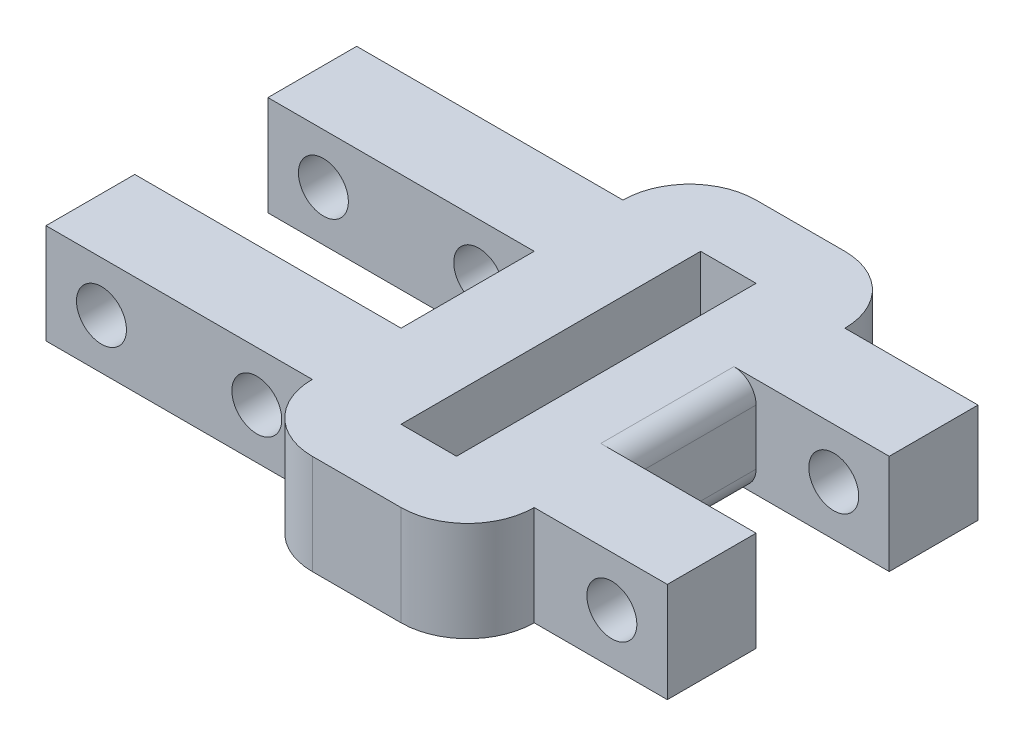
ISO-10303-21;
HEADER;
FILE_DESCRIPTION(('STEP AP214'),'2;1');
FILE_NAME('part.step','',(''),(''),'','','');
FILE_SCHEMA(('AUTOMOTIVE_DESIGN { 1 0 10303 214 1 1 1 1 }'));
ENDSEC;
DATA;
#1=APPLICATION_CONTEXT('core data for automotive mechanical design processes');
#2=APPLICATION_PROTOCOL_DEFINITION('international standard','automotive_design',2000,#1);
#3=PRODUCT_CONTEXT('',#1,'mechanical');
#4=PRODUCT('Part','Part','',(#3));
#5=PRODUCT_RELATED_PRODUCT_CATEGORY('part','',(#4));
#6=PRODUCT_DEFINITION_FORMATION('','',#4);
#7=PRODUCT_DEFINITION_CONTEXT('part definition',#1,'design');
#8=PRODUCT_DEFINITION('design','',#6,#7);
#9=PRODUCT_DEFINITION_SHAPE('','',#8);
#10=(LENGTH_UNIT() NAMED_UNIT(*) SI_UNIT(.MILLI.,.METRE.));
#11=(NAMED_UNIT(*) PLANE_ANGLE_UNIT() SI_UNIT($,.RADIAN.));
#12=(NAMED_UNIT(*) SI_UNIT($,.STERADIAN.) SOLID_ANGLE_UNIT());
#13=UNCERTAINTY_MEASURE_WITH_UNIT(LENGTH_MEASURE(1.E-05),#10,'distance_accuracy_value','');
#14=(GEOMETRIC_REPRESENTATION_CONTEXT(3) GLOBAL_UNCERTAINTY_ASSIGNED_CONTEXT((#13)) GLOBAL_UNIT_ASSIGNED_CONTEXT((#10,
#11,#12)) REPRESENTATION_CONTEXT('',''));
#15=CARTESIAN_POINT('',(0.,0.,0.));
#16=DIRECTION('',(0.,0.,1.));
#17=DIRECTION('',(1.,0.,0.));
#18=AXIS2_PLACEMENT_3D('',#15,#16,#17);
#19=CARTESIAN_POINT('',(-2.,4.5,-7.00000000000001));
#20=DIRECTION('',(0.,-1.,0.));
#21=DIRECTION('',(0.,0.,-1.));
#22=AXIS2_PLACEMENT_3D('',#19,#20,#21);
#23=PLANE('',#22);
#24=DIRECTION('',(0.,0.,-1.));
#25=VECTOR('',#24,1.);
#26=CARTESIAN_POINT('',(3.99999999999773,4.5,-7.00000000000001));
#27=LINE('',#26,#25);
#28=CARTESIAN_POINT('',(3.99999999999773,4.5,3.));
#29=VERTEX_POINT('',#28);
#30=CARTESIAN_POINT('',(3.99999999999773,4.5,-3.));
#31=VERTEX_POINT('',#30);
#32=EDGE_CURVE('E407',#29,#31,#27,.T.);
#33=ORIENTED_EDGE('',*,*,#32,.T.);
#34=DIRECTION('',(1.,0.,0.));
#35=VECTOR('',#34,1.);
#36=CARTESIAN_POINT('',(11.,4.5,-3.));
#37=LINE('',#36,#35);
#38=CARTESIAN_POINT('',(11.,4.5,-3.));
#39=VERTEX_POINT('',#38);
#40=EDGE_CURVE('E48',#31,#39,#37,.T.);
#41=ORIENTED_EDGE('',*,*,#40,.T.);
#42=DIRECTION('',(0.,0.,-1.));
#43=VECTOR('',#42,1.);
#44=CARTESIAN_POINT('',(11.,4.5,-7.));
#45=LINE('',#44,#43);
#46=CARTESIAN_POINT('',(11.,4.5,-7.));
#47=VERTEX_POINT('',#46);
#48=EDGE_CURVE('E280',#39,#47,#45,.T.);
#49=ORIENTED_EDGE('',*,*,#48,.T.);
#50=DIRECTION('',(-1.,0.,0.));
#51=VECTOR('',#50,1.);
#52=CARTESIAN_POINT('',(11.,4.5,-7.));
#53=LINE('',#52,#51);
#54=CARTESIAN_POINT('',(5.,4.5,-7.00000000000001));
#55=VERTEX_POINT('',#54);
#56=EDGE_CURVE('E282',#47,#55,#53,.T.);
#57=ORIENTED_EDGE('',*,*,#56,.T.);
#58=CARTESIAN_POINT('',(2.,4.5,-7.00000000000001));
#59=DIRECTION('',(0.,1.,0.));
#60=DIRECTION('',(0.,0.,1.));
#61=AXIS2_PLACEMENT_3D('',#58,#59,#60);
#62=CIRCLE('',#61,3.);
#63=CARTESIAN_POINT('',(2.,4.5,-10.));
#64=VERTEX_POINT('',#63);
#65=EDGE_CURVE('E284',#55,#64,#62,.T.);
#66=ORIENTED_EDGE('',*,*,#65,.T.);
#67=DIRECTION('',(-1.,0.,0.));
#68=VECTOR('',#67,1.);
#69=CARTESIAN_POINT('',(-2.,4.5,-10.));
#70=LINE('',#69,#68);
#71=CARTESIAN_POINT('',(-2.,4.5,-10.));
#72=VERTEX_POINT('',#71);
#73=EDGE_CURVE('E286',#64,#72,#70,.T.);
#74=ORIENTED_EDGE('',*,*,#73,.T.);
#75=CARTESIAN_POINT('',(-2.,4.5,-7.00000000000001));
#76=DIRECTION('',(0.,1.,0.));
#77=DIRECTION('',(0.,0.,-1.));
#78=AXIS2_PLACEMENT_3D('',#75,#76,#77);
#79=CIRCLE('',#78,3.);
#80=CARTESIAN_POINT('',(-5.,4.5,-7.00000000000001));
#81=VERTEX_POINT('',#80);
#82=EDGE_CURVE('E250',#72,#81,#79,.T.);
#83=ORIENTED_EDGE('',*,*,#82,.T.);
#84=DIRECTION('',(-1.,0.,0.));
#85=VECTOR('',#84,1.);
#86=CARTESIAN_POINT('',(-5.,4.5,-7.00000000000001));
#87=LINE('',#86,#85);
#88=CARTESIAN_POINT('',(-17.,4.5,-6.99999999999999));
#89=VERTEX_POINT('',#88);
#90=EDGE_CURVE('E253',#81,#89,#87,.T.);
#91=ORIENTED_EDGE('',*,*,#90,.T.);
#92=DIRECTION('',(0.,0.,1.));
#93=VECTOR('',#92,1.);
#94=CARTESIAN_POINT('',(-17.,4.5,-6.99999999999999));
#95=LINE('',#94,#93);
#96=CARTESIAN_POINT('',(-17.,4.5,-2.99999999999999));
#97=VERTEX_POINT('',#96);
#98=EDGE_CURVE('E256',#89,#97,#95,.T.);
#99=ORIENTED_EDGE('',*,*,#98,.T.);
#100=DIRECTION('',(1.,0.,0.));
#101=VECTOR('',#100,1.);
#102=CARTESIAN_POINT('',(-17.,4.5,-2.99999999999999));
#103=LINE('',#102,#101);
#104=CARTESIAN_POINT('',(-5.,4.5,-3.));
#105=VERTEX_POINT('',#104);
#106=EDGE_CURVE('E258',#97,#105,#103,.T.);
#107=ORIENTED_EDGE('',*,*,#106,.T.);
#108=DIRECTION('',(0.,0.,1.));
#109=VECTOR('',#108,1.);
#110=CARTESIAN_POINT('',(-5.,4.5,-3.));
#111=LINE('',#110,#109);
#112=CARTESIAN_POINT('',(-5.,4.5,3.));
#113=VERTEX_POINT('',#112);
#114=EDGE_CURVE('E260',#105,#113,#111,.T.);
#115=ORIENTED_EDGE('',*,*,#114,.T.);
#116=DIRECTION('',(-1.,0.,0.));
#117=VECTOR('',#116,1.);
#118=CARTESIAN_POINT('',(-5.,4.5,3.));
#119=LINE('',#118,#117);
#120=CARTESIAN_POINT('',(-17.,4.5,3.));
#121=VERTEX_POINT('',#120);
#122=EDGE_CURVE('E262',#113,#121,#119,.T.);
#123=ORIENTED_EDGE('',*,*,#122,.T.);
#124=DIRECTION('',(0.,0.,1.));
#125=VECTOR('',#124,1.);
#126=CARTESIAN_POINT('',(-17.,4.5,3.));
#127=LINE('',#126,#125);
#128=CARTESIAN_POINT('',(-17.,4.5,6.99999999999999));
#129=VERTEX_POINT('',#128);
#130=EDGE_CURVE('E264',#121,#129,#127,.T.);
#131=ORIENTED_EDGE('',*,*,#130,.T.);
#132=DIRECTION('',(1.,0.,0.));
#133=VECTOR('',#132,1.);
#134=CARTESIAN_POINT('',(-5.,4.5,6.99999999999999));
#135=LINE('',#134,#133);
#136=CARTESIAN_POINT('',(-5.,4.5,6.99999999999999));
#137=VERTEX_POINT('',#136);
#138=EDGE_CURVE('E266',#129,#137,#135,.T.);
#139=ORIENTED_EDGE('',*,*,#138,.T.);
#140=CARTESIAN_POINT('',(-2.,4.5,6.99999999999999));
#141=DIRECTION('',(0.,1.,0.));
#142=DIRECTION('',(0.,0.,-1.));
#143=AXIS2_PLACEMENT_3D('',#140,#141,#142);
#144=CIRCLE('',#143,3.);
#145=CARTESIAN_POINT('',(-2.,4.5,9.99999999999999));
#146=VERTEX_POINT('',#145);
#147=EDGE_CURVE('E268',#137,#146,#144,.T.);
#148=ORIENTED_EDGE('',*,*,#147,.T.);
#149=DIRECTION('',(1.,0.,0.));
#150=VECTOR('',#149,1.);
#151=CARTESIAN_POINT('',(-2.,4.5,9.99999999999999));
#152=LINE('',#151,#150);
#153=CARTESIAN_POINT('',(2.,4.5,9.99999999999999));
#154=VERTEX_POINT('',#153);
#155=EDGE_CURVE('E270',#146,#154,#152,.T.);
#156=ORIENTED_EDGE('',*,*,#155,.T.);
#157=CARTESIAN_POINT('',(2.,4.5,6.99999999999999));
#158=DIRECTION('',(0.,1.,0.));
#159=DIRECTION('',(0.,0.,-1.));
#160=AXIS2_PLACEMENT_3D('',#157,#158,#159);
#161=CIRCLE('',#160,3.);
#162=CARTESIAN_POINT('',(5.,4.5,6.99999999999999));
#163=VERTEX_POINT('',#162);
#164=EDGE_CURVE('E272',#154,#163,#161,.T.);
#165=ORIENTED_EDGE('',*,*,#164,.T.);
#166=DIRECTION('',(1.,0.,0.));
#167=VECTOR('',#166,1.);
#168=CARTESIAN_POINT('',(11.,4.5,7.));
#169=LINE('',#168,#167);
#170=CARTESIAN_POINT('',(11.,4.5,7.));
#171=VERTEX_POINT('',#170);
#172=EDGE_CURVE('E274',#163,#171,#169,.T.);
#173=ORIENTED_EDGE('',*,*,#172,.T.);
#174=DIRECTION('',(0.,0.,-1.));
#175=VECTOR('',#174,1.);
#176=CARTESIAN_POINT('',(11.,4.5,7.));
#177=LINE('',#176,#175);
#178=CARTESIAN_POINT('',(11.,4.5,3.));
#179=VERTEX_POINT('',#178);
#180=EDGE_CURVE('E276',#171,#179,#177,.T.);
#181=ORIENTED_EDGE('',*,*,#180,.T.);
#182=DIRECTION('',(-1.,0.,0.));
#183=VECTOR('',#182,1.);
#184=CARTESIAN_POINT('',(11.,4.5,3.));
#185=LINE('',#184,#183);
#186=EDGE_CURVE('E56',#179,#29,#185,.T.);
#187=ORIENTED_EDGE('',*,*,#186,.T.);
#188=EDGE_LOOP('',(#33,#41,#49,#57,#66,#74,#83,#91,#99,#107,#115,#123,#131,#139,#148,#156,#165,
#173,#181,#187));
#189=FACE_BOUND('',#188,.T.);
#190=DIRECTION('',(0.,0.,-1.));
#191=VECTOR('',#190,1.);
#192=CARTESIAN_POINT('',(1.25,4.5,6.75));
#193=LINE('',#192,#191);
#194=CARTESIAN_POINT('',(1.25,4.5,6.75));
#195=VERTEX_POINT('',#194);
#196=CARTESIAN_POINT('',(1.25,4.5,-6.75));
#197=VERTEX_POINT('',#196);
#198=EDGE_CURVE('E207',#195,#197,#193,.T.);
#199=ORIENTED_EDGE('',*,*,#198,.F.);
#200=DIRECTION('',(1.,0.,0.));
#201=VECTOR('',#200,1.);
#202=CARTESIAN_POINT('',(-1.25,4.5,6.75));
#203=LINE('',#202,#201);
#204=CARTESIAN_POINT('',(-1.25,4.5,6.75));
#205=VERTEX_POINT('',#204);
#206=EDGE_CURVE('E232',#205,#195,#203,.T.);
#207=ORIENTED_EDGE('',*,*,#206,.F.);
#208=DIRECTION('',(0.,0.,1.));
#209=VECTOR('',#208,1.);
#210=CARTESIAN_POINT('',(-1.25,4.5,6.75));
#211=LINE('',#210,#209);
#212=CARTESIAN_POINT('',(-1.25,4.5,-6.75));
#213=VERTEX_POINT('',#212);
#214=EDGE_CURVE('E230',#213,#205,#211,.T.);
#215=ORIENTED_EDGE('',*,*,#214,.F.);
#216=DIRECTION('',(-1.,0.,0.));
#217=VECTOR('',#216,1.);
#218=CARTESIAN_POINT('',(-1.25,4.5,-6.75));
#219=LINE('',#218,#217);
#220=EDGE_CURVE('E217',#197,#213,#219,.T.);
#221=ORIENTED_EDGE('',*,*,#220,.F.);
#222=EDGE_LOOP('',(#199,#207,#215,#221));
#223=FACE_BOUND('',#222,.T.);
#224=ADVANCED_FACE('F33',(#189,#223),#23,.F.);
#225=CARTESIAN_POINT('',(-2.,0.,-7.00000000000001));
#226=DIRECTION('',(0.,-1.,0.));
#227=DIRECTION('',(0.,0.,-1.));
#228=AXIS2_PLACEMENT_3D('',#225,#226,#227);
#229=PLANE('',#228);
#230=DIRECTION('',(1.,0.,0.));
#231=VECTOR('',#230,1.);
#232=CARTESIAN_POINT('',(11.,0.,-3.));
#233=LINE('',#232,#231);
#234=CARTESIAN_POINT('',(3.99999999999773,0.,-3.));
#235=VERTEX_POINT('',#234);
#236=CARTESIAN_POINT('',(11.,0.,-3.));
#237=VERTEX_POINT('',#236);
#238=EDGE_CURVE('E317',#235,#237,#233,.T.);
#239=ORIENTED_EDGE('',*,*,#238,.F.);
#240=DIRECTION('',(0.,0.,-1.));
#241=VECTOR('',#240,1.);
#242=CARTESIAN_POINT('',(3.99999999999773,0.,3.));
#243=LINE('',#242,#241);
#244=CARTESIAN_POINT('',(3.99999999999773,0.,3.));
#245=VERTEX_POINT('',#244);
#246=EDGE_CURVE('E404',#235,#245,#243,.F.);
#247=ORIENTED_EDGE('',*,*,#246,.T.);
#248=DIRECTION('',(-1.,0.,0.));
#249=VECTOR('',#248,1.);
#250=CARTESIAN_POINT('',(11.,0.,3.));
#251=LINE('',#250,#249);
#252=CARTESIAN_POINT('',(11.,0.,3.));
#253=VERTEX_POINT('',#252);
#254=EDGE_CURVE('E315',#253,#245,#251,.T.);
#255=ORIENTED_EDGE('',*,*,#254,.F.);
#256=DIRECTION('',(0.,0.,-1.));
#257=VECTOR('',#256,1.);
#258=CARTESIAN_POINT('',(11.,0.,7.));
#259=LINE('',#258,#257);
#260=CARTESIAN_POINT('',(11.,0.,7.));
#261=VERTEX_POINT('',#260);
#262=EDGE_CURVE('E313',#261,#253,#259,.T.);
#263=ORIENTED_EDGE('',*,*,#262,.F.);
#264=DIRECTION('',(1.,0.,0.));
#265=VECTOR('',#264,1.);
#266=CARTESIAN_POINT('',(11.,0.,7.));
#267=LINE('',#266,#265);
#268=CARTESIAN_POINT('',(5.,0.,6.99999999999999));
#269=VERTEX_POINT('',#268);
#270=EDGE_CURVE('E311',#269,#261,#267,.T.);
#271=ORIENTED_EDGE('',*,*,#270,.F.);
#272=CARTESIAN_POINT('',(2.,0.,6.99999999999999));
#273=DIRECTION('',(0.,1.,0.));
#274=DIRECTION('',(0.,0.,-1.));
#275=AXIS2_PLACEMENT_3D('',#272,#273,#274);
#276=CIRCLE('',#275,3.);
#277=CARTESIAN_POINT('',(2.,0.,9.99999999999999));
#278=VERTEX_POINT('',#277);
#279=EDGE_CURVE('E309',#278,#269,#276,.T.);
#280=ORIENTED_EDGE('',*,*,#279,.F.);
#281=DIRECTION('',(1.,0.,0.));
#282=VECTOR('',#281,1.);
#283=CARTESIAN_POINT('',(-2.,0.,9.99999999999999));
#284=LINE('',#283,#282);
#285=CARTESIAN_POINT('',(-2.,0.,9.99999999999999));
#286=VERTEX_POINT('',#285);
#287=EDGE_CURVE('E307',#286,#278,#284,.T.);
#288=ORIENTED_EDGE('',*,*,#287,.F.);
#289=CARTESIAN_POINT('',(-2.,0.,6.99999999999999));
#290=DIRECTION('',(0.,1.,0.));
#291=DIRECTION('',(0.,0.,-1.));
#292=AXIS2_PLACEMENT_3D('',#289,#290,#291);
#293=CIRCLE('',#292,3.);
#294=CARTESIAN_POINT('',(-5.,0.,6.99999999999999));
#295=VERTEX_POINT('',#294);
#296=EDGE_CURVE('E305',#295,#286,#293,.T.);
#297=ORIENTED_EDGE('',*,*,#296,.F.);
#298=DIRECTION('',(1.,0.,0.));
#299=VECTOR('',#298,1.);
#300=CARTESIAN_POINT('',(-5.,0.,6.99999999999999));
#301=LINE('',#300,#299);
#302=CARTESIAN_POINT('',(-17.,0.,6.99999999999999));
#303=VERTEX_POINT('',#302);
#304=EDGE_CURVE('E303',#303,#295,#301,.T.);
#305=ORIENTED_EDGE('',*,*,#304,.F.);
#306=DIRECTION('',(0.,0.,1.));
#307=VECTOR('',#306,1.);
#308=CARTESIAN_POINT('',(-17.,0.,3.));
#309=LINE('',#308,#307);
#310=CARTESIAN_POINT('',(-17.,0.,3.));
#311=VERTEX_POINT('',#310);
#312=EDGE_CURVE('E301',#311,#303,#309,.T.);
#313=ORIENTED_EDGE('',*,*,#312,.F.);
#314=DIRECTION('',(-1.,0.,0.));
#315=VECTOR('',#314,1.);
#316=CARTESIAN_POINT('',(-5.,0.,3.));
#317=LINE('',#316,#315);
#318=CARTESIAN_POINT('',(-5.,0.,3.));
#319=VERTEX_POINT('',#318);
#320=EDGE_CURVE('E299',#319,#311,#317,.T.);
#321=ORIENTED_EDGE('',*,*,#320,.F.);
#322=DIRECTION('',(0.,0.,1.));
#323=VECTOR('',#322,1.);
#324=CARTESIAN_POINT('',(-5.,0.,-3.));
#325=LINE('',#324,#323);
#326=CARTESIAN_POINT('',(-5.,0.,-3.));
#327=VERTEX_POINT('',#326);
#328=EDGE_CURVE('E297',#327,#319,#325,.T.);
#329=ORIENTED_EDGE('',*,*,#328,.F.);
#330=DIRECTION('',(1.,0.,0.));
#331=VECTOR('',#330,1.);
#332=CARTESIAN_POINT('',(-17.,0.,-2.99999999999999));
#333=LINE('',#332,#331);
#334=CARTESIAN_POINT('',(-17.,0.,-2.99999999999999));
#335=VERTEX_POINT('',#334);
#336=EDGE_CURVE('E295',#335,#327,#333,.T.);
#337=ORIENTED_EDGE('',*,*,#336,.F.);
#338=DIRECTION('',(0.,0.,1.));
#339=VECTOR('',#338,1.);
#340=CARTESIAN_POINT('',(-17.,0.,-6.99999999999999));
#341=LINE('',#340,#339);
#342=CARTESIAN_POINT('',(-17.,0.,-6.99999999999999));
#343=VERTEX_POINT('',#342);
#344=EDGE_CURVE('E293',#343,#335,#341,.T.);
#345=ORIENTED_EDGE('',*,*,#344,.F.);
#346=DIRECTION('',(-1.,0.,0.));
#347=VECTOR('',#346,1.);
#348=CARTESIAN_POINT('',(-5.,0.,-7.00000000000001));
#349=LINE('',#348,#347);
#350=CARTESIAN_POINT('',(-5.,0.,-7.00000000000001));
#351=VERTEX_POINT('',#350);
#352=EDGE_CURVE('E291',#351,#343,#349,.T.);
#353=ORIENTED_EDGE('',*,*,#352,.F.);
#354=CARTESIAN_POINT('',(-2.,0.,-7.00000000000001));
#355=DIRECTION('',(0.,1.,0.));
#356=DIRECTION('',(0.,0.,-1.));
#357=AXIS2_PLACEMENT_3D('',#354,#355,#356);
#358=CIRCLE('',#357,3.);
#359=CARTESIAN_POINT('',(-2.,0.,-10.));
#360=VERTEX_POINT('',#359);
#361=EDGE_CURVE('E225',#360,#351,#358,.T.);
#362=ORIENTED_EDGE('',*,*,#361,.F.);
#363=DIRECTION('',(-1.,0.,0.));
#364=VECTOR('',#363,1.);
#365=CARTESIAN_POINT('',(-2.,0.,-10.));
#366=LINE('',#365,#364);
#367=CARTESIAN_POINT('',(2.,0.,-10.));
#368=VERTEX_POINT('',#367);
#369=EDGE_CURVE('E254',#368,#360,#366,.T.);
#370=ORIENTED_EDGE('',*,*,#369,.F.);
#371=CARTESIAN_POINT('',(2.,0.,-7.00000000000001));
#372=DIRECTION('',(0.,1.,0.));
#373=DIRECTION('',(0.,0.,1.));
#374=AXIS2_PLACEMENT_3D('',#371,#372,#373);
#375=CIRCLE('',#374,3.);
#376=CARTESIAN_POINT('',(5.,0.,-7.00000000000001));
#377=VERTEX_POINT('',#376);
#378=EDGE_CURVE('E323',#377,#368,#375,.T.);
#379=ORIENTED_EDGE('',*,*,#378,.F.);
#380=DIRECTION('',(-1.,0.,0.));
#381=VECTOR('',#380,1.);
#382=CARTESIAN_POINT('',(11.,0.,-7.));
#383=LINE('',#382,#381);
#384=CARTESIAN_POINT('',(11.,0.,-7.));
#385=VERTEX_POINT('',#384);
#386=EDGE_CURVE('E321',#385,#377,#383,.T.);
#387=ORIENTED_EDGE('',*,*,#386,.F.);
#388=DIRECTION('',(0.,0.,-1.));
#389=VECTOR('',#388,1.);
#390=CARTESIAN_POINT('',(11.,0.,-7.));
#391=LINE('',#390,#389);
#392=EDGE_CURVE('E319',#237,#385,#391,.T.);
#393=ORIENTED_EDGE('',*,*,#392,.F.);
#394=EDGE_LOOP('',(#239,#247,#255,#263,#271,#280,#288,#297,#305,#313,#321,#329,#337,#345,#353,
#362,#370,#379,#387,#393));
#395=FACE_BOUND('',#394,.T.);
#396=DIRECTION('',(1.,0.,0.));
#397=VECTOR('',#396,1.);
#398=CARTESIAN_POINT('',(-1.25,0.,6.75));
#399=LINE('',#398,#397);
#400=CARTESIAN_POINT('',(-1.25,0.,6.75));
#401=VERTEX_POINT('',#400);
#402=CARTESIAN_POINT('',(1.25,0.,6.75));
#403=VERTEX_POINT('',#402);
#404=EDGE_CURVE('E218',#401,#403,#399,.T.);
#405=ORIENTED_EDGE('',*,*,#404,.T.);
#406=DIRECTION('',(0.,0.,-1.));
#407=VECTOR('',#406,1.);
#408=CARTESIAN_POINT('',(1.25,0.,6.75));
#409=LINE('',#408,#407);
#410=CARTESIAN_POINT('',(1.25,0.,-6.75));
#411=VERTEX_POINT('',#410);
#412=EDGE_CURVE('E237',#403,#411,#409,.T.);
#413=ORIENTED_EDGE('',*,*,#412,.T.);
#414=DIRECTION('',(-1.,0.,0.));
#415=VECTOR('',#414,1.);
#416=CARTESIAN_POINT('',(-1.25,0.,-6.75));
#417=LINE('',#416,#415);
#418=CARTESIAN_POINT('',(-1.25,0.,-6.75));
#419=VERTEX_POINT('',#418);
#420=EDGE_CURVE('E224',#411,#419,#417,.T.);
#421=ORIENTED_EDGE('',*,*,#420,.T.);
#422=DIRECTION('',(0.,0.,1.));
#423=VECTOR('',#422,1.);
#424=CARTESIAN_POINT('',(-1.25,0.,6.75));
#425=LINE('',#424,#423);
#426=EDGE_CURVE('E241',#419,#401,#425,.T.);
#427=ORIENTED_EDGE('',*,*,#426,.T.);
#428=EDGE_LOOP('',(#405,#413,#421,#427));
#429=FACE_BOUND('',#428,.T.);
#430=ADVANCED_FACE('F436',(#395,#429),#229,.T.);
#431=CARTESIAN_POINT('',(-2.,4.5,-7.00000000000001));
#432=DIRECTION('',(0.,-1.,0.));
#433=DIRECTION('',(0.,0.,-1.));
#434=AXIS2_PLACEMENT_3D('',#431,#432,#433);
#435=CYLINDRICAL_SURFACE('',#434,3.);
#436=ORIENTED_EDGE('',*,*,#361,.T.);
#437=DIRECTION('',(0.,-1.,0.));
#438=VECTOR('',#437,1.);
#439=CARTESIAN_POINT('',(-5.,4.5,-7.00000000000001));
#440=LINE('',#439,#438);
#441=EDGE_CURVE('E382',#81,#351,#440,.T.);
#442=ORIENTED_EDGE('',*,*,#441,.F.);
#443=ORIENTED_EDGE('',*,*,#82,.F.);
#444=DIRECTION('',(0.,-1.,0.));
#445=VECTOR('',#444,1.);
#446=CARTESIAN_POINT('',(-2.,4.5,-10.));
#447=LINE('',#446,#445);
#448=EDGE_CURVE('E288',#72,#360,#447,.T.);
#449=ORIENTED_EDGE('',*,*,#448,.T.);
#450=EDGE_LOOP('',(#436,#442,#443,#449));
#451=FACE_BOUND('',#450,.T.);
#452=ADVANCED_FACE('F456',(#451),#435,.T.);
#453=CARTESIAN_POINT('',(-5.,4.5,-7.00000000000001));
#454=DIRECTION('',(0.,0.,1.));
#455=DIRECTION('',(1.,0.,0.));
#456=AXIS2_PLACEMENT_3D('',#453,#454,#455);
#457=PLANE('',#456);
#458=CARTESIAN_POINT('',(-7.50000000000002,2.25,-7.));
#459=DIRECTION('',(0.,0.,1.));
#460=DIRECTION('',(1.,0.,0.));
#461=AXIS2_PLACEMENT_3D('',#458,#459,#460);
#462=CIRCLE('',#461,1.125);
#463=CARTESIAN_POINT('',(-6.37500000000002,2.25,-7.00000000000001));
#464=VERTEX_POINT('',#463);
#465=EDGE_CURVE('E390',#464,#464,#462,.F.);
#466=ORIENTED_EDGE('',*,*,#465,.F.);
#467=EDGE_LOOP('',(#466));
#468=FACE_BOUND('',#467,.T.);
#469=CARTESIAN_POINT('',(-14.5,2.25,-7.));
#470=DIRECTION('',(0.,0.,1.));
#471=DIRECTION('',(1.,0.,0.));
#472=AXIS2_PLACEMENT_3D('',#469,#470,#471);
#473=CIRCLE('',#472,1.125);
#474=CARTESIAN_POINT('',(-13.375,2.25,-7.));
#475=VERTEX_POINT('',#474);
#476=EDGE_CURVE('E239',#475,#475,#473,.F.);
#477=ORIENTED_EDGE('',*,*,#476,.F.);
#478=EDGE_LOOP('',(#477));
#479=FACE_BOUND('',#478,.T.);
#480=ORIENTED_EDGE('',*,*,#352,.T.);
#481=DIRECTION('',(0.,-1.,0.));
#482=VECTOR('',#481,1.);
#483=CARTESIAN_POINT('',(-17.,4.5,-6.99999999999999));
#484=LINE('',#483,#482);
#485=EDGE_CURVE('E379',#89,#343,#484,.T.);
#486=ORIENTED_EDGE('',*,*,#485,.F.);
#487=ORIENTED_EDGE('',*,*,#90,.F.);
#488=ORIENTED_EDGE('',*,*,#441,.T.);
#489=EDGE_LOOP('',(#480,#486,#487,#488));
#490=FACE_BOUND('',#489,.T.);
#491=ADVANCED_FACE('F458',(#468,#479,#490),#457,.F.);
#492=CARTESIAN_POINT('',(-17.,4.5,-6.99999999999999));
#493=DIRECTION('',(1.,0.,0.));
#494=DIRECTION('',(0.,0.,-1.));
#495=AXIS2_PLACEMENT_3D('',#492,#493,#494);
#496=PLANE('',#495);
#497=ORIENTED_EDGE('',*,*,#344,.T.);
#498=DIRECTION('',(0.,-1.,0.));
#499=VECTOR('',#498,1.);
#500=CARTESIAN_POINT('',(-17.,4.5,-2.99999999999999));
#501=LINE('',#500,#499);
#502=EDGE_CURVE('E376',#97,#335,#501,.T.);
#503=ORIENTED_EDGE('',*,*,#502,.F.);
#504=ORIENTED_EDGE('',*,*,#98,.F.);
#505=ORIENTED_EDGE('',*,*,#485,.T.);
#506=EDGE_LOOP('',(#497,#503,#504,#505));
#507=FACE_BOUND('',#506,.T.);
#508=ADVANCED_FACE('F465',(#507),#496,.F.);
#509=CARTESIAN_POINT('',(-17.,4.5,-2.99999999999999));
#510=DIRECTION('',(0.,0.,-1.));
#511=DIRECTION('',(-1.,0.,0.));
#512=AXIS2_PLACEMENT_3D('',#509,#510,#511);
#513=PLANE('',#512);
#514=CARTESIAN_POINT('',(-7.50000000000002,2.25,-3.));
#515=DIRECTION('',(0.,0.,-1.));
#516=DIRECTION('',(-1.,0.,0.));
#517=AXIS2_PLACEMENT_3D('',#514,#515,#516);
#518=CIRCLE('',#517,1.125);
#519=CARTESIAN_POINT('',(-8.62500000000002,2.25,-3.));
#520=VERTEX_POINT('',#519);
#521=EDGE_CURVE('E820',#520,#520,#518,.F.);
#522=ORIENTED_EDGE('',*,*,#521,.F.);
#523=EDGE_LOOP('',(#522));
#524=FACE_BOUND('',#523,.T.);
#525=CARTESIAN_POINT('',(-14.5,2.25,-2.99999999999999));
#526=DIRECTION('',(0.,0.,-1.));
#527=DIRECTION('',(-1.,0.,0.));
#528=AXIS2_PLACEMENT_3D('',#525,#526,#527);
#529=CIRCLE('',#528,1.125);
#530=CARTESIAN_POINT('',(-15.625,2.25,-2.99999999999999));
#531=VERTEX_POINT('',#530);
#532=EDGE_CURVE('E813',#531,#531,#529,.F.);
#533=ORIENTED_EDGE('',*,*,#532,.F.);
#534=EDGE_LOOP('',(#533));
#535=FACE_BOUND('',#534,.T.);
#536=ORIENTED_EDGE('',*,*,#336,.T.);
#537=DIRECTION('',(0.,-1.,0.));
#538=VECTOR('',#537,1.);
#539=CARTESIAN_POINT('',(-5.,4.5,-3.));
#540=LINE('',#539,#538);
#541=EDGE_CURVE('E373',#105,#327,#540,.T.);
#542=ORIENTED_EDGE('',*,*,#541,.F.);
#543=ORIENTED_EDGE('',*,*,#106,.F.);
#544=ORIENTED_EDGE('',*,*,#502,.T.);
#545=EDGE_LOOP('',(#536,#542,#543,#544));
#546=FACE_BOUND('',#545,.T.);
#547=ADVANCED_FACE('F469',(#524,#535,#546),#513,.F.);
#548=CARTESIAN_POINT('',(-5.,4.5,-3.));
#549=DIRECTION('',(1.,0.,0.));
#550=DIRECTION('',(0.,0.,-1.));
#551=AXIS2_PLACEMENT_3D('',#548,#549,#550);
#552=PLANE('',#551);
#553=ORIENTED_EDGE('',*,*,#328,.T.);
#554=DIRECTION('',(0.,-1.,0.));
#555=VECTOR('',#554,1.);
#556=CARTESIAN_POINT('',(-5.,4.5,3.));
#557=LINE('',#556,#555);
#558=EDGE_CURVE('E370',#113,#319,#557,.T.);
#559=ORIENTED_EDGE('',*,*,#558,.F.);
#560=ORIENTED_EDGE('',*,*,#114,.F.);
#561=ORIENTED_EDGE('',*,*,#541,.T.);
#562=EDGE_LOOP('',(#553,#559,#560,#561));
#563=FACE_BOUND('',#562,.T.);
#564=ADVANCED_FACE('F474',(#563),#552,.F.);
#565=CARTESIAN_POINT('',(-5.,4.5,3.));
#566=DIRECTION('',(0.,0.,1.));
#567=DIRECTION('',(1.,0.,0.));
#568=AXIS2_PLACEMENT_3D('',#565,#566,#567);
#569=PLANE('',#568);
#570=CARTESIAN_POINT('',(-7.50000000000002,2.25,3.));
#571=DIRECTION('',(0.,0.,1.));
#572=DIRECTION('',(1.,0.,0.));
#573=AXIS2_PLACEMENT_3D('',#570,#571,#572);
#574=CIRCLE('',#573,1.125);
#575=CARTESIAN_POINT('',(-6.37500000000002,2.25,3.));
#576=VERTEX_POINT('',#575);
#577=EDGE_CURVE('E398',#576,#576,#574,.F.);
#578=ORIENTED_EDGE('',*,*,#577,.F.);
#579=EDGE_LOOP('',(#578));
#580=FACE_BOUND('',#579,.T.);
#581=CARTESIAN_POINT('',(-14.5,2.25,3.));
#582=DIRECTION('',(0.,0.,1.));
#583=DIRECTION('',(1.,0.,0.));
#584=AXIS2_PLACEMENT_3D('',#581,#582,#583);
#585=CIRCLE('',#584,1.125);
#586=CARTESIAN_POINT('',(-13.375,2.25,3.));
#587=VERTEX_POINT('',#586);
#588=EDGE_CURVE('E389',#587,#587,#585,.F.);
#589=ORIENTED_EDGE('',*,*,#588,.F.);
#590=EDGE_LOOP('',(#589));
#591=FACE_BOUND('',#590,.T.);
#592=ORIENTED_EDGE('',*,*,#320,.T.);
#593=DIRECTION('',(0.,-1.,0.));
#594=VECTOR('',#593,1.);
#595=CARTESIAN_POINT('',(-17.,4.5,3.));
#596=LINE('',#595,#594);
#597=EDGE_CURVE('E367',#121,#311,#596,.T.);
#598=ORIENTED_EDGE('',*,*,#597,.F.);
#599=ORIENTED_EDGE('',*,*,#122,.F.);
#600=ORIENTED_EDGE('',*,*,#558,.T.);
#601=EDGE_LOOP('',(#592,#598,#599,#600));
#602=FACE_BOUND('',#601,.T.);
#603=ADVANCED_FACE('F480',(#580,#591,#602),#569,.F.);
#604=CARTESIAN_POINT('',(-17.,4.5,3.));
#605=DIRECTION('',(1.,0.,0.));
#606=DIRECTION('',(0.,0.,-1.));
#607=AXIS2_PLACEMENT_3D('',#604,#605,#606);
#608=PLANE('',#607);
#609=ORIENTED_EDGE('',*,*,#312,.T.);
#610=DIRECTION('',(0.,-1.,0.));
#611=VECTOR('',#610,1.);
#612=CARTESIAN_POINT('',(-17.,4.5,6.99999999999999));
#613=LINE('',#612,#611);
#614=EDGE_CURVE('E364',#129,#303,#613,.T.);
#615=ORIENTED_EDGE('',*,*,#614,.F.);
#616=ORIENTED_EDGE('',*,*,#130,.F.);
#617=ORIENTED_EDGE('',*,*,#597,.T.);
#618=EDGE_LOOP('',(#609,#615,#616,#617));
#619=FACE_BOUND('',#618,.T.);
#620=ADVANCED_FACE('F484',(#619),#608,.F.);
#621=CARTESIAN_POINT('',(-5.,4.5,6.99999999999999));
#622=DIRECTION('',(0.,0.,-1.));
#623=DIRECTION('',(-1.,0.,0.));
#624=AXIS2_PLACEMENT_3D('',#621,#622,#623);
#625=PLANE('',#624);
#626=CARTESIAN_POINT('',(-7.50000000000002,2.25,6.99999999999999));
#627=DIRECTION('',(0.,0.,-1.));
#628=DIRECTION('',(-1.,0.,0.));
#629=AXIS2_PLACEMENT_3D('',#626,#627,#628);
#630=CIRCLE('',#629,1.125);
#631=CARTESIAN_POINT('',(-8.62500000000002,2.25,6.99999999999999));
#632=VERTEX_POINT('',#631);
#633=EDGE_CURVE('E395',#632,#632,#630,.F.);
#634=ORIENTED_EDGE('',*,*,#633,.F.);
#635=EDGE_LOOP('',(#634));
#636=FACE_BOUND('',#635,.T.);
#637=CARTESIAN_POINT('',(-14.5,2.25,6.99999999999999));
#638=DIRECTION('',(0.,0.,-1.));
#639=DIRECTION('',(-1.,0.,0.));
#640=AXIS2_PLACEMENT_3D('',#637,#638,#639);
#641=CIRCLE('',#640,1.125);
#642=CARTESIAN_POINT('',(-15.625,2.25,6.99999999999999));
#643=VERTEX_POINT('',#642);
#644=EDGE_CURVE('E386',#643,#643,#641,.F.);
#645=ORIENTED_EDGE('',*,*,#644,.F.);
#646=EDGE_LOOP('',(#645));
#647=FACE_BOUND('',#646,.T.);
#648=ORIENTED_EDGE('',*,*,#304,.T.);
#649=DIRECTION('',(0.,-1.,0.));
#650=VECTOR('',#649,1.);
#651=CARTESIAN_POINT('',(-5.,4.5,6.99999999999999));
#652=LINE('',#651,#650);
#653=EDGE_CURVE('E361',#137,#295,#652,.T.);
#654=ORIENTED_EDGE('',*,*,#653,.F.);
#655=ORIENTED_EDGE('',*,*,#138,.F.);
#656=ORIENTED_EDGE('',*,*,#614,.T.);
#657=EDGE_LOOP('',(#648,#654,#655,#656));
#658=FACE_BOUND('',#657,.T.);
#659=ADVANCED_FACE('F489',(#636,#647,#658),#625,.F.);
#660=CARTESIAN_POINT('',(-2.,4.5,6.99999999999999));
#661=DIRECTION('',(0.,-1.,0.));
#662=DIRECTION('',(0.,0.,-1.));
#663=AXIS2_PLACEMENT_3D('',#660,#661,#662);
#664=CYLINDRICAL_SURFACE('',#663,3.);
#665=ORIENTED_EDGE('',*,*,#296,.T.);
#666=DIRECTION('',(0.,-1.,0.));
#667=VECTOR('',#666,1.);
#668=CARTESIAN_POINT('',(-2.,4.5,9.99999999999999));
#669=LINE('',#668,#667);
#670=EDGE_CURVE('E358',#146,#286,#669,.T.);
#671=ORIENTED_EDGE('',*,*,#670,.F.);
#672=ORIENTED_EDGE('',*,*,#147,.F.);
#673=ORIENTED_EDGE('',*,*,#653,.T.);
#674=EDGE_LOOP('',(#665,#671,#672,#673));
#675=FACE_BOUND('',#674,.T.);
#676=ADVANCED_FACE('F495',(#675),#664,.T.);
#677=CARTESIAN_POINT('',(-2.,4.5,9.99999999999999));
#678=DIRECTION('',(0.,0.,-1.));
#679=DIRECTION('',(-1.,0.,0.));
#680=AXIS2_PLACEMENT_3D('',#677,#678,#679);
#681=PLANE('',#680);
#682=ORIENTED_EDGE('',*,*,#287,.T.);
#683=DIRECTION('',(0.,-1.,0.));
#684=VECTOR('',#683,1.);
#685=CARTESIAN_POINT('',(2.,4.5,9.99999999999999));
#686=LINE('',#685,#684);
#687=EDGE_CURVE('E355',#154,#278,#686,.T.);
#688=ORIENTED_EDGE('',*,*,#687,.F.);
#689=ORIENTED_EDGE('',*,*,#155,.F.);
#690=ORIENTED_EDGE('',*,*,#670,.T.);
#691=EDGE_LOOP('',(#682,#688,#689,#690));
#692=FACE_BOUND('',#691,.T.);
#693=ADVANCED_FACE('F499',(#692),#681,.F.);
#694=CARTESIAN_POINT('',(2.,4.5,6.99999999999999));
#695=DIRECTION('',(0.,-1.,0.));
#696=DIRECTION('',(0.,0.,-1.));
#697=AXIS2_PLACEMENT_3D('',#694,#695,#696);
#698=CYLINDRICAL_SURFACE('',#697,3.);
#699=ORIENTED_EDGE('',*,*,#279,.T.);
#700=DIRECTION('',(0.,-1.,0.));
#701=VECTOR('',#700,1.);
#702=CARTESIAN_POINT('',(5.,4.5,6.99999999999999));
#703=LINE('',#702,#701);
#704=EDGE_CURVE('E352',#163,#269,#703,.T.);
#705=ORIENTED_EDGE('',*,*,#704,.F.);
#706=ORIENTED_EDGE('',*,*,#164,.F.);
#707=ORIENTED_EDGE('',*,*,#687,.T.);
#708=EDGE_LOOP('',(#699,#705,#706,#707));
#709=FACE_BOUND('',#708,.T.);
#710=ADVANCED_FACE('F504',(#709),#698,.T.);
#711=CARTESIAN_POINT('',(11.,4.5,7.));
#712=DIRECTION('',(0.,0.,-1.));
#713=DIRECTION('',(-1.,0.,0.));
#714=AXIS2_PLACEMENT_3D('',#711,#712,#713);
#715=PLANE('',#714);
#716=CARTESIAN_POINT('',(8.49999999999995,2.25,7.));
#717=DIRECTION('',(0.,0.,-1.));
#718=DIRECTION('',(-1.,0.,0.));
#719=AXIS2_PLACEMENT_3D('',#716,#717,#718);
#720=CIRCLE('',#719,1.125);
#721=CARTESIAN_POINT('',(7.37499999999995,2.25,7.));
#722=VERTEX_POINT('',#721);
#723=EDGE_CURVE('E399',#722,#722,#720,.F.);
#724=ORIENTED_EDGE('',*,*,#723,.F.);
#725=EDGE_LOOP('',(#724));
#726=FACE_BOUND('',#725,.T.);
#727=ORIENTED_EDGE('',*,*,#270,.T.);
#728=DIRECTION('',(0.,-1.,0.));
#729=VECTOR('',#728,1.);
#730=CARTESIAN_POINT('',(11.,4.5,7.));
#731=LINE('',#730,#729);
#732=EDGE_CURVE('E349',#171,#261,#731,.T.);
#733=ORIENTED_EDGE('',*,*,#732,.F.);
#734=ORIENTED_EDGE('',*,*,#172,.F.);
#735=ORIENTED_EDGE('',*,*,#704,.T.);
#736=EDGE_LOOP('',(#727,#733,#734,#735));
#737=FACE_BOUND('',#736,.T.);
#738=ADVANCED_FACE('F510',(#726,#737),#715,.F.);
#739=CARTESIAN_POINT('',(11.,4.5,7.));
#740=DIRECTION('',(-1.,0.,0.));
#741=DIRECTION('',(0.,0.,1.));
#742=AXIS2_PLACEMENT_3D('',#739,#740,#741);
#743=PLANE('',#742);
#744=ORIENTED_EDGE('',*,*,#262,.T.);
#745=DIRECTION('',(0.,-1.,0.));
#746=VECTOR('',#745,1.);
#747=CARTESIAN_POINT('',(11.,4.5,3.));
#748=LINE('',#747,#746);
#749=EDGE_CURVE('E346',#179,#253,#748,.T.);
#750=ORIENTED_EDGE('',*,*,#749,.F.);
#751=ORIENTED_EDGE('',*,*,#180,.F.);
#752=ORIENTED_EDGE('',*,*,#732,.T.);
#753=EDGE_LOOP('',(#744,#750,#751,#752));
#754=FACE_BOUND('',#753,.T.);
#755=ADVANCED_FACE('F514',(#754),#743,.F.);
#756=CARTESIAN_POINT('',(11.,4.5,3.));
#757=DIRECTION('',(0.,0.,1.));
#758=DIRECTION('',(1.,0.,0.));
#759=AXIS2_PLACEMENT_3D('',#756,#757,#758);
#760=PLANE('',#759);
#761=CARTESIAN_POINT('',(8.49999999999995,2.25,3.));
#762=DIRECTION('',(0.,0.,1.));
#763=DIRECTION('',(1.,0.,0.));
#764=AXIS2_PLACEMENT_3D('',#761,#762,#763);
#765=CIRCLE('',#764,1.125);
#766=CARTESIAN_POINT('',(9.62499999999995,2.25,3.));
#767=VERTEX_POINT('',#766);
#768=EDGE_CURVE('E827',#767,#767,#765,.F.);
#769=ORIENTED_EDGE('',*,*,#768,.F.);
#770=EDGE_LOOP('',(#769));
#771=FACE_BOUND('',#770,.T.);
#772=ORIENTED_EDGE('',*,*,#254,.T.);
#773=CARTESIAN_POINT('',(3.99999999999773,1.,3.));
#774=DIRECTION('',(0.,0.,1.));
#775=DIRECTION('',(1.,0.,0.));
#776=AXIS2_PLACEMENT_3D('',#773,#774,#775);
#777=CIRCLE('',#776,1.);
#778=CARTESIAN_POINT('',(4.99999999999773,1.,3.));
#779=VERTEX_POINT('',#778);
#780=EDGE_CURVE('E412',#245,#779,#777,.T.);
#781=ORIENTED_EDGE('',*,*,#780,.T.);
#782=DIRECTION('',(0.,-1.,0.));
#783=VECTOR('',#782,1.);
#784=CARTESIAN_POINT('',(4.99999999999773,4.5,3.));
#785=LINE('',#784,#783);
#786=CARTESIAN_POINT('',(4.99999999999773,3.5,3.));
#787=VERTEX_POINT('',#786);
#788=EDGE_CURVE('E343',#787,#779,#785,.T.);
#789=ORIENTED_EDGE('',*,*,#788,.F.);
#790=CARTESIAN_POINT('',(3.99999999999773,3.5,3.));
#791=DIRECTION('',(0.,0.,1.));
#792=DIRECTION('',(1.,0.,0.));
#793=AXIS2_PLACEMENT_3D('',#790,#791,#792);
#794=CIRCLE('',#793,1.);
#795=EDGE_CURVE('E11',#787,#29,#794,.T.);
#796=ORIENTED_EDGE('',*,*,#795,.T.);
#797=ORIENTED_EDGE('',*,*,#186,.F.);
#798=ORIENTED_EDGE('',*,*,#749,.T.);
#799=EDGE_LOOP('',(#772,#781,#789,#796,#797,#798));
#800=FACE_BOUND('',#799,.T.);
#801=ADVANCED_FACE('F424',(#771,#800),#760,.F.);
#802=CARTESIAN_POINT('',(4.99999999999773,4.5,-3.));
#803=DIRECTION('',(-1.,0.,0.));
#804=DIRECTION('',(0.,0.,1.));
#805=AXIS2_PLACEMENT_3D('',#802,#803,#804);
#806=PLANE('',#805);
#807=ORIENTED_EDGE('',*,*,#788,.T.);
#808=DIRECTION('',(0.,0.,-1.));
#809=VECTOR('',#808,1.);
#810=CARTESIAN_POINT('',(4.99999999999773,1.,-3.));
#811=LINE('',#810,#809);
#812=CARTESIAN_POINT('',(4.99999999999773,1.,-3.));
#813=VERTEX_POINT('',#812);
#814=EDGE_CURVE('E401',#779,#813,#811,.T.);
#815=ORIENTED_EDGE('',*,*,#814,.T.);
#816=DIRECTION('',(0.,-1.,0.));
#817=VECTOR('',#816,1.);
#818=CARTESIAN_POINT('',(4.99999999999773,4.5,-3.));
#819=LINE('',#818,#817);
#820=CARTESIAN_POINT('',(4.99999999999773,3.5,-3.));
#821=VERTEX_POINT('',#820);
#822=EDGE_CURVE('E340',#821,#813,#819,.T.);
#823=ORIENTED_EDGE('',*,*,#822,.F.);
#824=DIRECTION('',(0.,0.,-1.));
#825=VECTOR('',#824,1.);
#826=CARTESIAN_POINT('',(4.99999999999773,3.5,-3.));
#827=LINE('',#826,#825);
#828=EDGE_CURVE('E385',#821,#787,#827,.F.);
#829=ORIENTED_EDGE('',*,*,#828,.T.);
#830=EDGE_LOOP('',(#807,#815,#823,#829));
#831=FACE_BOUND('',#830,.T.);
#832=ADVANCED_FACE('F419',(#831),#806,.F.);
#833=CARTESIAN_POINT('',(11.,4.5,-3.));
#834=DIRECTION('',(0.,0.,-1.));
#835=DIRECTION('',(-1.,0.,0.));
#836=AXIS2_PLACEMENT_3D('',#833,#834,#835);
#837=PLANE('',#836);
#838=CARTESIAN_POINT('',(8.49999999999995,2.25,-3.));
#839=DIRECTION('',(0.,0.,-1.));
#840=DIRECTION('',(-1.,0.,0.));
#841=AXIS2_PLACEMENT_3D('',#838,#839,#840);
#842=CIRCLE('',#841,1.125);
#843=CARTESIAN_POINT('',(7.37499999999995,2.25,-3.));
#844=VERTEX_POINT('',#843);
#845=EDGE_CURVE('E394',#844,#844,#842,.F.);
#846=ORIENTED_EDGE('',*,*,#845,.F.);
#847=EDGE_LOOP('',(#846));
#848=FACE_BOUND('',#847,.T.);
#849=ORIENTED_EDGE('',*,*,#238,.T.);
#850=DIRECTION('',(0.,-1.,0.));
#851=VECTOR('',#850,1.);
#852=CARTESIAN_POINT('',(11.,4.5,-3.));
#853=LINE('',#852,#851);
#854=EDGE_CURVE('E337',#39,#237,#853,.T.);
#855=ORIENTED_EDGE('',*,*,#854,.F.);
#856=ORIENTED_EDGE('',*,*,#40,.F.);
#857=CARTESIAN_POINT('',(3.99999999999773,3.5,-3.));
#858=DIRECTION('',(0.,0.,-1.));
#859=DIRECTION('',(-1.,0.,0.));
#860=AXIS2_PLACEMENT_3D('',#857,#858,#859);
#861=CIRCLE('',#860,1.);
#862=EDGE_CURVE('E41',#31,#821,#861,.T.);
#863=ORIENTED_EDGE('',*,*,#862,.T.);
#864=ORIENTED_EDGE('',*,*,#822,.T.);
#865=CARTESIAN_POINT('',(3.99999999999773,1.,-3.));
#866=DIRECTION('',(0.,0.,-1.));
#867=DIRECTION('',(-1.,0.,0.));
#868=AXIS2_PLACEMENT_3D('',#865,#866,#867);
#869=CIRCLE('',#868,1.);
#870=EDGE_CURVE('E409',#813,#235,#869,.T.);
#871=ORIENTED_EDGE('',*,*,#870,.T.);
#872=EDGE_LOOP('',(#849,#855,#856,#863,#864,#871));
#873=FACE_BOUND('',#872,.T.);
#874=ADVANCED_FACE('F414',(#848,#873),#837,.F.);
#875=CARTESIAN_POINT('',(11.,4.5,-7.));
#876=DIRECTION('',(-1.,0.,0.));
#877=DIRECTION('',(0.,0.,1.));
#878=AXIS2_PLACEMENT_3D('',#875,#876,#877);
#879=PLANE('',#878);
#880=ORIENTED_EDGE('',*,*,#392,.T.);
#881=DIRECTION('',(0.,-1.,0.));
#882=VECTOR('',#881,1.);
#883=CARTESIAN_POINT('',(11.,4.5,-7.));
#884=LINE('',#883,#882);
#885=EDGE_CURVE('E334',#47,#385,#884,.T.);
#886=ORIENTED_EDGE('',*,*,#885,.F.);
#887=ORIENTED_EDGE('',*,*,#48,.F.);
#888=ORIENTED_EDGE('',*,*,#854,.T.);
#889=EDGE_LOOP('',(#880,#886,#887,#888));
#890=FACE_BOUND('',#889,.T.);
#891=ADVANCED_FACE('F433',(#890),#879,.F.);
#892=CARTESIAN_POINT('',(11.,4.5,-7.));
#893=DIRECTION('',(0.,0.,1.));
#894=DIRECTION('',(1.,0.,0.));
#895=AXIS2_PLACEMENT_3D('',#892,#893,#894);
#896=PLANE('',#895);
#897=CARTESIAN_POINT('',(8.49999999999995,2.25,-7.));
#898=DIRECTION('',(0.,0.,1.));
#899=DIRECTION('',(1.,0.,0.));
#900=AXIS2_PLACEMENT_3D('',#897,#898,#899);
#901=CIRCLE('',#900,1.125);
#902=CARTESIAN_POINT('',(9.62499999999995,2.25,-7.));
#903=VERTEX_POINT('',#902);
#904=EDGE_CURVE('E391',#903,#903,#901,.F.);
#905=ORIENTED_EDGE('',*,*,#904,.F.);
#906=EDGE_LOOP('',(#905));
#907=FACE_BOUND('',#906,.T.);
#908=ORIENTED_EDGE('',*,*,#386,.T.);
#909=DIRECTION('',(0.,-1.,0.));
#910=VECTOR('',#909,1.);
#911=CARTESIAN_POINT('',(5.,4.5,-7.00000000000001));
#912=LINE('',#911,#910);
#913=EDGE_CURVE('E331',#55,#377,#912,.T.);
#914=ORIENTED_EDGE('',*,*,#913,.F.);
#915=ORIENTED_EDGE('',*,*,#56,.F.);
#916=ORIENTED_EDGE('',*,*,#885,.T.);
#917=EDGE_LOOP('',(#908,#914,#915,#916));
#918=FACE_BOUND('',#917,.T.);
#919=ADVANCED_FACE('F442',(#907,#918),#896,.F.);
#920=CARTESIAN_POINT('',(2.,4.5,-7.00000000000001));
#921=DIRECTION('',(0.,-1.,0.));
#922=DIRECTION('',(0.,0.,-1.));
#923=AXIS2_PLACEMENT_3D('',#920,#921,#922);
#924=CYLINDRICAL_SURFACE('',#923,3.);
#925=ORIENTED_EDGE('',*,*,#378,.T.);
#926=DIRECTION('',(0.,-1.,0.));
#927=VECTOR('',#926,1.);
#928=CARTESIAN_POINT('',(2.,4.5,-10.));
#929=LINE('',#928,#927);
#930=EDGE_CURVE('E328',#64,#368,#929,.T.);
#931=ORIENTED_EDGE('',*,*,#930,.F.);
#932=ORIENTED_EDGE('',*,*,#65,.F.);
#933=ORIENTED_EDGE('',*,*,#913,.T.);
#934=EDGE_LOOP('',(#925,#931,#932,#933));
#935=FACE_BOUND('',#934,.T.);
#936=ADVANCED_FACE('F446',(#935),#924,.T.);
#937=CARTESIAN_POINT('',(-2.,4.5,-10.));
#938=DIRECTION('',(0.,0.,1.));
#939=DIRECTION('',(1.,0.,0.));
#940=AXIS2_PLACEMENT_3D('',#937,#938,#939);
#941=PLANE('',#940);
#942=ORIENTED_EDGE('',*,*,#369,.T.);
#943=ORIENTED_EDGE('',*,*,#448,.F.);
#944=ORIENTED_EDGE('',*,*,#73,.F.);
#945=ORIENTED_EDGE('',*,*,#930,.T.);
#946=EDGE_LOOP('',(#942,#943,#944,#945));
#947=FACE_BOUND('',#946,.T.);
#948=ADVANCED_FACE('F453',(#947),#941,.F.);
#949=CARTESIAN_POINT('',(1.25,4.5,6.75));
#950=DIRECTION('',(-1.,0.,0.));
#951=DIRECTION('',(0.,0.,1.));
#952=AXIS2_PLACEMENT_3D('',#949,#950,#951);
#953=PLANE('',#952);
#954=ORIENTED_EDGE('',*,*,#412,.F.);
#955=DIRECTION('',(0.,-1.,0.));
#956=VECTOR('',#955,1.);
#957=CARTESIAN_POINT('',(1.25,4.5,6.75));
#958=LINE('',#957,#956);
#959=EDGE_CURVE('E213',#195,#403,#958,.T.);
#960=ORIENTED_EDGE('',*,*,#959,.F.);
#961=ORIENTED_EDGE('',*,*,#198,.T.);
#962=DIRECTION('',(0.,-1.,0.));
#963=VECTOR('',#962,1.);
#964=CARTESIAN_POINT('',(1.25,4.5,-6.75));
#965=LINE('',#964,#963);
#966=EDGE_CURVE('E210',#197,#411,#965,.T.);
#967=ORIENTED_EDGE('',*,*,#966,.T.);
#968=EDGE_LOOP('',(#954,#960,#961,#967));
#969=FACE_BOUND('',#968,.T.);
#970=ADVANCED_FACE('F209',(#969),#953,.T.);
#971=CARTESIAN_POINT('',(-1.25,4.5,-6.75));
#972=DIRECTION('',(0.,0.,1.));
#973=DIRECTION('',(1.,0.,0.));
#974=AXIS2_PLACEMENT_3D('',#971,#972,#973);
#975=PLANE('',#974);
#976=ORIENTED_EDGE('',*,*,#420,.F.);
#977=ORIENTED_EDGE('',*,*,#966,.F.);
#978=ORIENTED_EDGE('',*,*,#220,.T.);
#979=DIRECTION('',(0.,-1.,0.));
#980=VECTOR('',#979,1.);
#981=CARTESIAN_POINT('',(-1.25,4.5,-6.75));
#982=LINE('',#981,#980);
#983=EDGE_CURVE('E226',#213,#419,#982,.T.);
#984=ORIENTED_EDGE('',*,*,#983,.T.);
#985=EDGE_LOOP('',(#976,#977,#978,#984));
#986=FACE_BOUND('',#985,.T.);
#987=ADVANCED_FACE('F221',(#986),#975,.T.);
#988=CARTESIAN_POINT('',(-1.25,4.5,6.75));
#989=DIRECTION('',(1.,0.,0.));
#990=DIRECTION('',(0.,0.,-1.));
#991=AXIS2_PLACEMENT_3D('',#988,#989,#990);
#992=PLANE('',#991);
#993=ORIENTED_EDGE('',*,*,#426,.F.);
#994=ORIENTED_EDGE('',*,*,#983,.F.);
#995=ORIENTED_EDGE('',*,*,#214,.T.);
#996=DIRECTION('',(0.,-1.,0.));
#997=VECTOR('',#996,1.);
#998=CARTESIAN_POINT('',(-1.25,4.5,6.75));
#999=LINE('',#998,#997);
#1000=EDGE_CURVE('E247',#205,#401,#999,.T.);
#1001=ORIENTED_EDGE('',*,*,#1000,.T.);
#1002=EDGE_LOOP('',(#993,#994,#995,#1001));
#1003=FACE_BOUND('',#1002,.T.);
#1004=ADVANCED_FACE('F586',(#1003),#992,.T.);
#1005=CARTESIAN_POINT('',(-1.25,4.5,6.75));
#1006=DIRECTION('',(0.,0.,-1.));
#1007=DIRECTION('',(-1.,0.,0.));
#1008=AXIS2_PLACEMENT_3D('',#1005,#1006,#1007);
#1009=PLANE('',#1008);
#1010=ORIENTED_EDGE('',*,*,#404,.F.);
#1011=ORIENTED_EDGE('',*,*,#1000,.F.);
#1012=ORIENTED_EDGE('',*,*,#206,.T.);
#1013=ORIENTED_EDGE('',*,*,#959,.T.);
#1014=EDGE_LOOP('',(#1010,#1011,#1012,#1013));
#1015=FACE_BOUND('',#1014,.T.);
#1016=ADVANCED_FACE('F592',(#1015),#1009,.T.);
#1017=CARTESIAN_POINT('',(-14.5,2.25,13.5));
#1018=DIRECTION('',(0.,0.,-1.));
#1019=DIRECTION('',(-1.,0.,0.));
#1020=AXIS2_PLACEMENT_3D('',#1017,#1018,#1019);
#1021=CYLINDRICAL_SURFACE('',#1020,1.125);
#1022=ORIENTED_EDGE('',*,*,#644,.T.);
#1023=EDGE_LOOP('',(#1022));
#1024=FACE_BOUND('',#1023,.T.);
#1025=ORIENTED_EDGE('',*,*,#588,.T.);
#1026=EDGE_LOOP('',(#1025));
#1027=FACE_BOUND('',#1026,.T.);
#1028=ADVANCED_FACE('F600',(#1024,#1027),#1021,.F.);
#1029=ORIENTED_EDGE('',*,*,#532,.T.);
#1030=EDGE_LOOP('',(#1029));
#1031=FACE_BOUND('',#1030,.T.);
#1032=ORIENTED_EDGE('',*,*,#476,.T.);
#1033=EDGE_LOOP('',(#1032));
#1034=FACE_BOUND('',#1033,.T.);
#1035=ADVANCED_FACE('F608',(#1031,#1034),#1021,.F.);
#1036=CARTESIAN_POINT('',(8.49999999999995,2.25,13.5));
#1037=DIRECTION('',(0.,0.,-1.));
#1038=DIRECTION('',(-1.,0.,0.));
#1039=AXIS2_PLACEMENT_3D('',#1036,#1037,#1038);
#1040=CYLINDRICAL_SURFACE('',#1039,1.125);
#1041=ORIENTED_EDGE('',*,*,#904,.T.);
#1042=EDGE_LOOP('',(#1041));
#1043=FACE_BOUND('',#1042,.T.);
#1044=ORIENTED_EDGE('',*,*,#845,.T.);
#1045=EDGE_LOOP('',(#1044));
#1046=FACE_BOUND('',#1045,.T.);
#1047=ADVANCED_FACE('F616',(#1043,#1046),#1040,.F.);
#1048=ORIENTED_EDGE('',*,*,#768,.T.);
#1049=EDGE_LOOP('',(#1048));
#1050=FACE_BOUND('',#1049,.T.);
#1051=ORIENTED_EDGE('',*,*,#723,.T.);
#1052=EDGE_LOOP('',(#1051));
#1053=FACE_BOUND('',#1052,.T.);
#1054=ADVANCED_FACE('F623',(#1050,#1053),#1040,.F.);
#1055=CARTESIAN_POINT('',(-7.50000000000002,2.25,13.5));
#1056=DIRECTION('',(0.,0.,-1.));
#1057=DIRECTION('',(-1.,0.,0.));
#1058=AXIS2_PLACEMENT_3D('',#1055,#1056,#1057);
#1059=CYLINDRICAL_SURFACE('',#1058,1.125);
#1060=ORIENTED_EDGE('',*,*,#633,.T.);
#1061=EDGE_LOOP('',(#1060));
#1062=FACE_BOUND('',#1061,.T.);
#1063=ORIENTED_EDGE('',*,*,#577,.T.);
#1064=EDGE_LOOP('',(#1063));
#1065=FACE_BOUND('',#1064,.T.);
#1066=ADVANCED_FACE('F631',(#1062,#1065),#1059,.F.);
#1067=ORIENTED_EDGE('',*,*,#521,.T.);
#1068=EDGE_LOOP('',(#1067));
#1069=FACE_BOUND('',#1068,.T.);
#1070=ORIENTED_EDGE('',*,*,#465,.T.);
#1071=EDGE_LOOP('',(#1070));
#1072=FACE_BOUND('',#1071,.T.);
#1073=ADVANCED_FACE('F638',(#1069,#1072),#1059,.F.);
#1074=CARTESIAN_POINT('',(3.99999999999773,1.,-3.));
#1075=DIRECTION('',(0.,0.,1.));
#1076=DIRECTION('',(1.,0.,0.));
#1077=AXIS2_PLACEMENT_3D('',#1074,#1075,#1076);
#1078=CYLINDRICAL_SURFACE('',#1077,1.);
#1079=ORIENTED_EDGE('',*,*,#780,.F.);
#1080=ORIENTED_EDGE('',*,*,#246,.F.);
#1081=ORIENTED_EDGE('',*,*,#870,.F.);
#1082=ORIENTED_EDGE('',*,*,#814,.F.);
#1083=EDGE_LOOP('',(#1079,#1080,#1081,#1082));
#1084=FACE_BOUND('',#1083,.T.);
#1085=ADVANCED_FACE('F427',(#1084),#1078,.T.);
#1086=CARTESIAN_POINT('',(3.99999999999773,3.5,-7.00000000000001));
#1087=DIRECTION('',(0.,0.,-1.));
#1088=DIRECTION('',(-1.,0.,0.));
#1089=AXIS2_PLACEMENT_3D('',#1086,#1087,#1088);
#1090=CYLINDRICAL_SURFACE('',#1089,1.);
#1091=ORIENTED_EDGE('',*,*,#795,.F.);
#1092=ORIENTED_EDGE('',*,*,#828,.F.);
#1093=ORIENTED_EDGE('',*,*,#862,.F.);
#1094=ORIENTED_EDGE('',*,*,#32,.F.);
#1095=EDGE_LOOP('',(#1091,#1092,#1093,#1094));
#1096=FACE_BOUND('',#1095,.T.);
#1097=ADVANCED_FACE('F35',(#1096),#1090,.T.);
#1098=CLOSED_SHELL('',(#224,#430,#452,#491,#508,#547,#564,#603,#620,#659,#676,#693,#710,#738,
#755,#801,#832,#874,#891,#919,#936,#948,#970,#987,#1004,#1016,#1028,#1035,#1047,#1054,#1066,
#1073,#1085,#1097));
#1099=MANIFOLD_SOLID_BREP('B2',#1098);
#1100=ADVANCED_BREP_SHAPE_REPRESENTATION('',(#18,#1099),#14);
#1101=SHAPE_DEFINITION_REPRESENTATION(#9,#1100);
ENDSEC;
END-ISO-10303-21;
